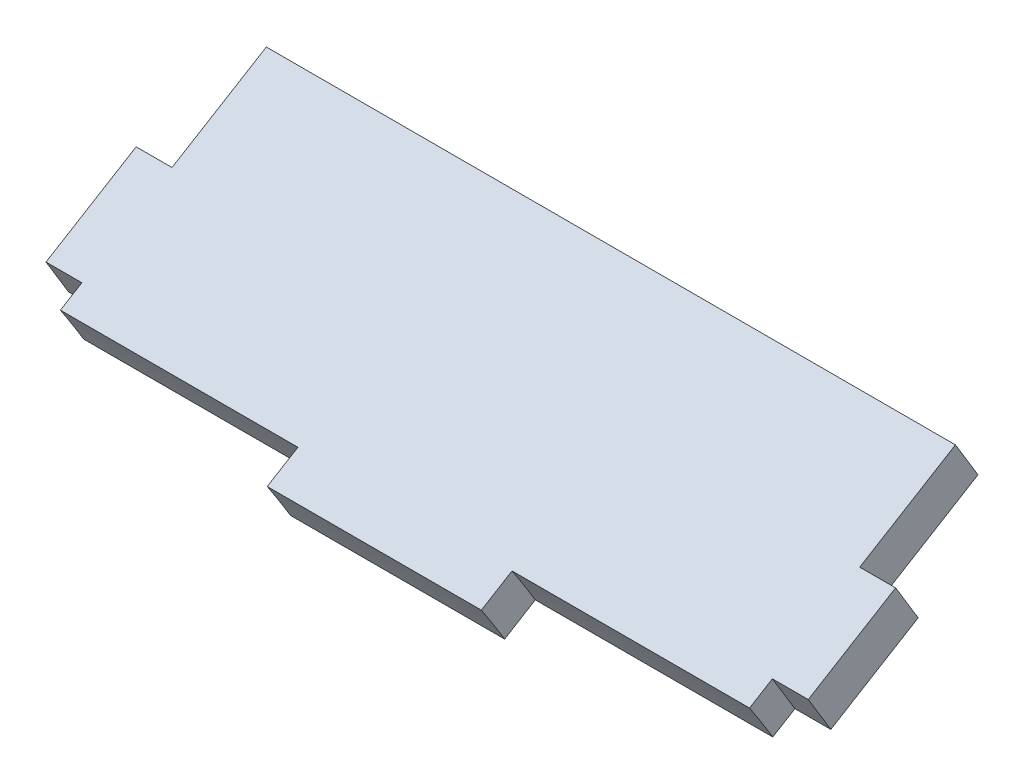
ISO-10303-21;
HEADER;
FILE_DESCRIPTION(('STEP AP214'),'2;1');
FILE_NAME('part.step','',(''),(''),'','','');
FILE_SCHEMA(('AUTOMOTIVE_DESIGN { 1 0 10303 214 1 1 1 1 }'));
ENDSEC;
DATA;
#1=APPLICATION_CONTEXT('core data for automotive mechanical design processes');
#2=APPLICATION_PROTOCOL_DEFINITION('international standard','automotive_design',2000,#1);
#3=PRODUCT_CONTEXT('',#1,'mechanical');
#4=PRODUCT('Part','Part','',(#3));
#5=PRODUCT_RELATED_PRODUCT_CATEGORY('part','',(#4));
#6=PRODUCT_DEFINITION_FORMATION('','',#4);
#7=PRODUCT_DEFINITION_CONTEXT('part definition',#1,'design');
#8=PRODUCT_DEFINITION('design','',#6,#7);
#9=PRODUCT_DEFINITION_SHAPE('','',#8);
#10=(LENGTH_UNIT() NAMED_UNIT(*) SI_UNIT(.MILLI.,.METRE.));
#11=(NAMED_UNIT(*) PLANE_ANGLE_UNIT() SI_UNIT($,.RADIAN.));
#12=(NAMED_UNIT(*) SI_UNIT($,.STERADIAN.) SOLID_ANGLE_UNIT());
#13=UNCERTAINTY_MEASURE_WITH_UNIT(LENGTH_MEASURE(1.E-05),#10,'distance_accuracy_value','');
#14=(GEOMETRIC_REPRESENTATION_CONTEXT(3) GLOBAL_UNCERTAINTY_ASSIGNED_CONTEXT((#13)) GLOBAL_UNIT_ASSIGNED_CONTEXT((#10,
#11,#12)) REPRESENTATION_CONTEXT('',''));
#15=CARTESIAN_POINT('',(0.,0.,0.));
#16=DIRECTION('',(0.,0.,1.));
#17=DIRECTION('',(1.,0.,0.));
#18=AXIS2_PLACEMENT_3D('',#15,#16,#17);
#19=CARTESIAN_POINT('',(-263.,125.092216151068,174.308993959894));
#20=DIRECTION('',(0.,0.518815236901239,-0.854886395937561));
#21=DIRECTION('',(0.,0.854886395937561,0.518815236901239));
#22=AXIS2_PLACEMENT_3D('',#19,#20,#21);
#23=PLANE('',#22);
#24=DIRECTION('',(0.,-0.854886395937561,-0.518815236901239));
#25=VECTOR('',#24,1.);
#26=CARTESIAN_POINT('',(-259.7,125.092216151068,174.308993959894));
#27=LINE('',#26,#25);
#28=CARTESIAN_POINT('',(-259.7,128.768227653599,176.53989947857));
#29=VERTEX_POINT('',#28);
#30=CARTESIAN_POINT('',(-259.7,125.348682069849,174.464638530965));
#31=VERTEX_POINT('',#30);
#32=EDGE_CURVE('E264',#29,#31,#27,.T.);
#33=ORIENTED_EDGE('',*,*,#32,.F.);
#34=DIRECTION('',(1.,0.,0.));
#35=VECTOR('',#34,1.);
#36=CARTESIAN_POINT('',(-359.949570915867,128.768227653599,176.53989947857));
#37=LINE('',#36,#35);
#38=CARTESIAN_POINT('',(-263.,128.768227653599,176.53989947857));
#39=VERTEX_POINT('',#38);
#40=EDGE_CURVE('E227',#39,#29,#37,.T.);
#41=ORIENTED_EDGE('',*,*,#40,.F.);
#42=DIRECTION('',(0.,0.854886395937561,0.518815236901239));
#43=VECTOR('',#42,1.);
#44=CARTESIAN_POINT('',(-263.,125.092216151068,174.308993959894));
#45=LINE('',#44,#43);
#46=CARTESIAN_POINT('',(-263.,125.348682069849,174.464638530965));
#47=VERTEX_POINT('',#46);
#48=EDGE_CURVE('E190',#47,#39,#45,.T.);
#49=ORIENTED_EDGE('',*,*,#48,.F.);
#50=DIRECTION('',(1.,0.,0.));
#51=VECTOR('',#50,1.);
#52=CARTESIAN_POINT('',(-359.949570915867,125.348682069849,174.464638530965));
#53=LINE('',#52,#51);
#54=EDGE_CURVE('E229',#47,#31,#53,.T.);
#55=ORIENTED_EDGE('',*,*,#54,.T.);
#56=EDGE_LOOP('',(#33,#41,#49,#55));
#57=FACE_BOUND('',#56,.T.);
#58=ADVANCED_FACE('F42',(#57),#23,.F.);
#59=CARTESIAN_POINT('',(-263.,133.901556799252,168.659611927827));
#60=DIRECTION('',(0.,-0.518815236901239,0.854886395937561));
#61=DIRECTION('',(0.,-0.854886395937561,-0.518815236901239));
#62=AXIS2_PLACEMENT_3D('',#59,#60,#61);
#63=PLANE('',#62);
#64=DIRECTION('',(0.,0.854886395937561,0.518815236901239));
#65=VECTOR('',#64,1.);
#66=CARTESIAN_POINT('',(-259.7,133.901556799252,168.659611927827));
#67=LINE('',#66,#65);
#68=CARTESIAN_POINT('',(-259.7,130.22554529672,166.428706409151));
#69=VERTEX_POINT('',#68);
#70=CARTESIAN_POINT('',(-259.7,133.645090880471,168.503967356756));
#71=VERTEX_POINT('',#70);
#72=EDGE_CURVE('E261',#69,#71,#67,.T.);
#73=ORIENTED_EDGE('',*,*,#72,.F.);
#74=DIRECTION('',(-1.,0.,0.));
#75=VECTOR('',#74,1.);
#76=CARTESIAN_POINT('',(-359.949570915867,130.22554529672,166.428706409151));
#77=LINE('',#76,#75);
#78=CARTESIAN_POINT('',(-263.,130.22554529672,166.428706409151));
#79=VERTEX_POINT('',#78);
#80=EDGE_CURVE('E221',#69,#79,#77,.T.);
#81=ORIENTED_EDGE('',*,*,#80,.T.);
#82=DIRECTION('',(0.,-0.854886395937561,-0.518815236901239));
#83=VECTOR('',#82,1.);
#84=CARTESIAN_POINT('',(-263.,133.901556799252,168.659611927827));
#85=LINE('',#84,#83);
#86=CARTESIAN_POINT('',(-263.,133.645090880471,168.503967356756));
#87=VERTEX_POINT('',#86);
#88=EDGE_CURVE('E230',#87,#79,#85,.T.);
#89=ORIENTED_EDGE('',*,*,#88,.F.);
#90=DIRECTION('',(-1.,0.,0.));
#91=VECTOR('',#90,1.);
#92=CARTESIAN_POINT('',(-359.949570915867,133.645090880471,168.503967356756));
#93=LINE('',#92,#91);
#94=EDGE_CURVE('E206',#71,#87,#93,.T.);
#95=ORIENTED_EDGE('',*,*,#94,.F.);
#96=EDGE_LOOP('',(#73,#81,#89,#95));
#97=FACE_BOUND('',#96,.T.);
#98=ADVANCED_FACE('F260',(#97),#63,.F.);
#99=CARTESIAN_POINT('',(-359.949570915867,127.376330221479,178.83342151614));
#100=DIRECTION('',(0.,-0.854886395937591,-0.518815236901189));
#101=DIRECTION('',(0.,0.518815236901189,-0.854886395937591));
#102=AXIS2_PLACEMENT_3D('',#99,#100,#101);
#103=PLANE('',#102);
#104=DIRECTION('',(-1.,0.,0.));
#105=VECTOR('',#104,1.);
#106=CARTESIAN_POINT('',(-359.949570915867,128.690405368064,176.66813243796));
#107=LINE('',#106,#105);
#108=CARTESIAN_POINT('',(-326.4,128.690405368064,176.66813243796));
#109=VERTEX_POINT('',#108);
#110=CARTESIAN_POINT('',(-329.7,128.690405368064,176.66813243796));
#111=VERTEX_POINT('',#110);
#112=EDGE_CURVE('E65',#109,#111,#107,.T.);
#113=ORIENTED_EDGE('',*,*,#112,.F.);
#114=DIRECTION('',(0.,-0.518815236901189,0.854886395937591));
#115=VECTOR('',#114,1.);
#116=CARTESIAN_POINT('',(-326.4,127.376330221479,178.83342151614));
#117=LINE('',#116,#115);
#118=CARTESIAN_POINT('',(-326.4,127.492166075794,178.642551069452));
#119=VERTEX_POINT('',#118);
#120=EDGE_CURVE('E200',#109,#119,#117,.T.);
#121=ORIENTED_EDGE('',*,*,#120,.T.);
#122=DIRECTION('',(1.,0.,0.));
#123=VECTOR('',#122,1.);
#124=CARTESIAN_POINT('',(-330.7,127.492166075794,178.642551069452));
#125=LINE('',#124,#123);
#126=CARTESIAN_POINT('',(-304.55,127.492166075794,178.642551069452));
#127=VERTEX_POINT('',#126);
#128=EDGE_CURVE('E222',#127,#119,#125,.F.);
#129=ORIENTED_EDGE('',*,*,#128,.F.);
#130=DIRECTION('',(0.,-0.518815236901234,0.854886395937563));
#131=VECTOR('',#130,1.);
#132=CARTESIAN_POINT('',(-304.55,127.33640658698,178.899206345849));
#133=LINE('',#132,#131);
#134=CARTESIAN_POINT('',(-304.55,125.778774108113,181.46582105055));
#135=VERTEX_POINT('',#134);
#136=EDGE_CURVE('E287',#127,#135,#133,.T.);
#137=ORIENTED_EDGE('',*,*,#136,.T.);
#138=DIRECTION('',(1.,0.,0.));
#139=VECTOR('',#138,1.);
#140=CARTESIAN_POINT('',(-330.701333630157,125.778774108113,181.46582105055));
#141=LINE('',#140,#139);
#142=CARTESIAN_POINT('',(-284.85,125.778774108113,181.46582105055));
#143=VERTEX_POINT('',#142);
#144=EDGE_CURVE('E267',#143,#135,#141,.F.);
#145=ORIENTED_EDGE('',*,*,#144,.F.);
#146=DIRECTION('',(0.,0.51881523690124,-0.85488639593756));
#147=VECTOR('',#146,1.);
#148=CARTESIAN_POINT('',(-284.850000000006,127.33640658698,178.899206345849));
#149=LINE('',#148,#147);
#150=CARTESIAN_POINT('',(-284.850000000006,127.492166075794,178.642551069452));
#151=VERTEX_POINT('',#150);
#152=EDGE_CURVE('E283',#143,#151,#149,.T.);
#153=ORIENTED_EDGE('',*,*,#152,.T.);
#154=CARTESIAN_POINT('',(-263.,127.492166075794,178.642551069452));
#155=VERTEX_POINT('',#154);
#156=EDGE_CURVE('E219',#155,#151,#125,.F.);
#157=ORIENTED_EDGE('',*,*,#156,.F.);
#158=DIRECTION('',(0.,0.518815236901189,-0.854886395937591));
#159=VECTOR('',#158,1.);
#160=CARTESIAN_POINT('',(-263.,127.376330221479,178.83342151614));
#161=LINE('',#160,#159);
#162=EDGE_CURVE('E225',#155,#39,#161,.T.);
#163=ORIENTED_EDGE('',*,*,#162,.T.);
#164=ORIENTED_EDGE('',*,*,#40,.T.);
#165=DIRECTION('',(0.,0.518815236901189,-0.854886395937591));
#166=VECTOR('',#165,1.);
#167=CARTESIAN_POINT('',(-259.7,140.841436247018,156.646070138711));
#168=LINE('',#167,#166);
#169=EDGE_CURVE('E177',#29,#71,#168,.T.);
#170=ORIENTED_EDGE('',*,*,#169,.T.);
#171=ORIENTED_EDGE('',*,*,#94,.T.);
#172=DIRECTION('',(0.,0.518815236901189,-0.854886395937591));
#173=VECTOR('',#172,1.);
#174=CARTESIAN_POINT('',(-263.,127.376330221479,178.83342151614));
#175=LINE('',#174,#173);
#176=CARTESIAN_POINT('',(-263.,138.988716152912,159.698920346798));
#177=VERTEX_POINT('',#176);
#178=EDGE_CURVE('E218',#87,#177,#175,.T.);
#179=ORIENTED_EDGE('',*,*,#178,.T.);
#180=DIRECTION('',(1.,0.,0.));
#181=VECTOR('',#180,1.);
#182=CARTESIAN_POINT('',(-359.949570915867,138.988716152912,159.698920346798));
#183=LINE('',#182,#181);
#184=CARTESIAN_POINT('',(-326.4,138.988716152911,159.698920346798));
#185=VERTEX_POINT('',#184);
#186=EDGE_CURVE('E210',#185,#177,#183,.T.);
#187=ORIENTED_EDGE('',*,*,#186,.F.);
#188=DIRECTION('',(0.,-0.518815236901189,0.854886395937591));
#189=VECTOR('',#188,1.);
#190=CARTESIAN_POINT('',(-326.4,127.376330221479,178.83342151614));
#191=LINE('',#190,#189);
#192=CARTESIAN_POINT('',(-326.4,133.722913166006,168.375734397366));
#193=VERTEX_POINT('',#192);
#194=EDGE_CURVE('E198',#185,#193,#191,.T.);
#195=ORIENTED_EDGE('',*,*,#194,.T.);
#196=DIRECTION('',(1.,0.,0.));
#197=VECTOR('',#196,1.);
#198=CARTESIAN_POINT('',(-359.949570915867,133.722913166006,168.375734397366));
#199=LINE('',#198,#197);
#200=CARTESIAN_POINT('',(-329.7,133.722913166006,168.375734397366));
#201=VERTEX_POINT('',#200);
#202=EDGE_CURVE('E168',#201,#193,#199,.T.);
#203=ORIENTED_EDGE('',*,*,#202,.F.);
#204=DIRECTION('',(0.,-0.518815236901189,0.854886395937591));
#205=VECTOR('',#204,1.);
#206=CARTESIAN_POINT('',(-329.7,140.841436247018,156.646070138711));
#207=LINE('',#206,#205);
#208=EDGE_CURVE('E323',#201,#111,#207,.T.);
#209=ORIENTED_EDGE('',*,*,#208,.T.);
#210=EDGE_LOOP('',(#113,#121,#129,#137,#145,#153,#157,#163,#164,#170,#171,#179,#187,#195,#203,#209));
#211=FACE_BOUND('',#210,.T.);
#212=ADVANCED_FACE('F310',(#211),#103,.F.);
#213=CARTESIAN_POINT('',(-359.949570915867,123.956784637729,176.758160568536));
#214=DIRECTION('',(0.,-0.854886395937591,-0.518815236901189));
#215=DIRECTION('',(0.,0.518815236901189,-0.854886395937591));
#216=AXIS2_PLACEMENT_3D('',#213,#214,#215);
#217=PLANE('',#216);
#218=DIRECTION('',(0.,-0.518815236901189,0.854886395937591));
#219=VECTOR('',#218,1.);
#220=CARTESIAN_POINT('',(-326.4,123.956784637729,176.758160568536));
#221=LINE('',#220,#219);
#222=CARTESIAN_POINT('',(-326.4,125.270859784314,174.592871490355));
#223=VERTEX_POINT('',#222);
#224=CARTESIAN_POINT('',(-326.4,124.112429208799,176.501694649754));
#225=VERTEX_POINT('',#224);
#226=EDGE_CURVE('E185',#223,#225,#221,.T.);
#227=ORIENTED_EDGE('',*,*,#226,.F.);
#228=DIRECTION('',(-1.,0.,0.));
#229=VECTOR('',#228,1.);
#230=CARTESIAN_POINT('',(-359.949570915867,125.270859784314,174.592871490355));
#231=LINE('',#230,#229);
#232=CARTESIAN_POINT('',(-329.7,125.270859784314,174.592871490355));
#233=VERTEX_POINT('',#232);
#234=EDGE_CURVE('E57',#223,#233,#231,.T.);
#235=ORIENTED_EDGE('',*,*,#234,.T.);
#236=DIRECTION('',(0.,0.518815236901189,-0.854886395937591));
#237=VECTOR('',#236,1.);
#238=CARTESIAN_POINT('',(-329.7,123.956784637729,176.758160568536));
#239=LINE('',#238,#237);
#240=CARTESIAN_POINT('',(-329.7,130.303367582256,166.300473449761));
#241=VERTEX_POINT('',#240);
#242=EDGE_CURVE('E165',#233,#241,#239,.T.);
#243=ORIENTED_EDGE('',*,*,#242,.T.);
#244=DIRECTION('',(1.,0.,0.));
#245=VECTOR('',#244,1.);
#246=CARTESIAN_POINT('',(-359.949570915867,130.303367582256,166.300473449761));
#247=LINE('',#246,#245);
#248=CARTESIAN_POINT('',(-326.4,130.303367582256,166.300473449761));
#249=VERTEX_POINT('',#248);
#250=EDGE_CURVE('E158',#241,#249,#247,.T.);
#251=ORIENTED_EDGE('',*,*,#250,.T.);
#252=DIRECTION('',(0.,-0.518815236901189,0.854886395937591));
#253=VECTOR('',#252,1.);
#254=CARTESIAN_POINT('',(-326.4,123.956784637729,176.758160568536));
#255=LINE('',#254,#253);
#256=CARTESIAN_POINT('',(-326.4,135.569170569161,157.623659399193));
#257=VERTEX_POINT('',#256);
#258=EDGE_CURVE('E163',#257,#249,#255,.T.);
#259=ORIENTED_EDGE('',*,*,#258,.F.);
#260=DIRECTION('',(1.,0.,0.));
#261=VECTOR('',#260,1.);
#262=CARTESIAN_POINT('',(-359.949570915867,135.569170569162,157.623659399193));
#263=LINE('',#262,#261);
#264=CARTESIAN_POINT('',(-263.,135.569170569162,157.623659399194));
#265=VERTEX_POINT('',#264);
#266=EDGE_CURVE('E215',#257,#265,#263,.T.);
#267=ORIENTED_EDGE('',*,*,#266,.T.);
#268=DIRECTION('',(0.,-0.518815236901189,0.854886395937591));
#269=VECTOR('',#268,1.);
#270=CARTESIAN_POINT('',(-263.,123.956784637729,176.758160568536));
#271=LINE('',#270,#269);
#272=EDGE_CURVE('E217',#265,#79,#271,.T.);
#273=ORIENTED_EDGE('',*,*,#272,.T.);
#274=ORIENTED_EDGE('',*,*,#80,.F.);
#275=DIRECTION('',(0.,-0.518815236901189,0.854886395937591));
#276=VECTOR('',#275,1.);
#277=CARTESIAN_POINT('',(-259.7,123.956784637729,176.758160568536));
#278=LINE('',#277,#276);
#279=EDGE_CURVE('E12',#69,#31,#278,.T.);
#280=ORIENTED_EDGE('',*,*,#279,.T.);
#281=ORIENTED_EDGE('',*,*,#54,.F.);
#282=CARTESIAN_POINT('',(-263.,124.112429208799,176.501694649754));
#283=VERTEX_POINT('',#282);
#284=EDGE_CURVE('E245',#47,#283,#271,.T.);
#285=ORIENTED_EDGE('',*,*,#284,.T.);
#286=DIRECTION('',(1.,0.,0.));
#287=VECTOR('',#286,1.);
#288=CARTESIAN_POINT('',(-330.7,124.112429208799,176.501694649754));
#289=LINE('',#288,#287);
#290=CARTESIAN_POINT('',(-284.850000000006,124.112429208799,176.501694649754));
#291=VERTEX_POINT('',#290);
#292=EDGE_CURVE('E207',#283,#291,#289,.F.);
#293=ORIENTED_EDGE('',*,*,#292,.T.);
#294=DIRECTION('',(0.,0.51881523690124,-0.85488639593756));
#295=VECTOR('',#294,1.);
#296=CARTESIAN_POINT('',(-284.850000000006,123.916861003229,176.823945398244));
#297=LINE('',#296,#295);
#298=CARTESIAN_POINT('',(-284.85,122.400338927025,179.322819756348));
#299=VERTEX_POINT('',#298);
#300=EDGE_CURVE('E284',#299,#291,#297,.T.);
#301=ORIENTED_EDGE('',*,*,#300,.F.);
#302=DIRECTION('',(1.,0.,0.));
#303=VECTOR('',#302,1.);
#304=CARTESIAN_POINT('',(-330.701333630157,122.400338927025,179.322819756348));
#305=LINE('',#304,#303);
#306=CARTESIAN_POINT('',(-304.55,122.400338927025,179.322819756348));
#307=VERTEX_POINT('',#306);
#308=EDGE_CURVE('E277',#307,#299,#305,.T.);
#309=ORIENTED_EDGE('',*,*,#308,.F.);
#310=DIRECTION('',(0.,-0.518815236901234,0.854886395937563));
#311=VECTOR('',#310,1.);
#312=CARTESIAN_POINT('',(-304.55,123.916861003229,176.823945398244));
#313=LINE('',#312,#311);
#314=CARTESIAN_POINT('',(-304.55,124.112429208799,176.501694649754));
#315=VERTEX_POINT('',#314);
#316=EDGE_CURVE('E286',#315,#307,#313,.T.);
#317=ORIENTED_EDGE('',*,*,#316,.F.);
#318=EDGE_CURVE('E211',#315,#225,#289,.F.);
#319=ORIENTED_EDGE('',*,*,#318,.T.);
#320=EDGE_LOOP('',(#227,#235,#243,#251,#259,#267,#273,#274,#280,#281,#285,#293,#301,#309,#317,#319));
#321=FACE_BOUND('',#320,.T.);
#322=ADVANCED_FACE('F161',(#321),#217,.T.);
#323=CARTESIAN_POINT('',(-326.4,133.979379084788,168.531378968436));
#324=DIRECTION('',(0.,0.518815236901239,-0.854886395937561));
#325=DIRECTION('',(0.,0.854886395937561,0.518815236901239));
#326=AXIS2_PLACEMENT_3D('',#323,#324,#325);
#327=PLANE('',#326);
#328=ORIENTED_EDGE('',*,*,#250,.F.);
#329=DIRECTION('',(0.,0.854886395937561,0.518815236901239));
#330=VECTOR('',#329,1.);
#331=CARTESIAN_POINT('',(-329.7,133.979379084788,168.531378968436));
#332=LINE('',#331,#330);
#333=EDGE_CURVE('E265',#241,#201,#332,.T.);
#334=ORIENTED_EDGE('',*,*,#333,.T.);
#335=ORIENTED_EDGE('',*,*,#202,.T.);
#336=DIRECTION('',(0.,0.854886395937561,0.518815236901237));
#337=VECTOR('',#336,1.);
#338=CARTESIAN_POINT('',(-326.4,-38.6852712980695,63.7442962419567));
#339=LINE('',#338,#337);
#340=EDGE_CURVE('E172',#249,#193,#339,.T.);
#341=ORIENTED_EDGE('',*,*,#340,.F.);
#342=EDGE_LOOP('',(#328,#334,#335,#341));
#343=FACE_BOUND('',#342,.T.);
#344=ADVANCED_FACE('F173',(#343),#327,.T.);
#345=CARTESIAN_POINT('',(-326.4,125.014393865533,174.437226919285));
#346=DIRECTION('',(0.,-0.518815236901239,0.854886395937561));
#347=DIRECTION('',(0.,-0.854886395937561,-0.518815236901239));
#348=AXIS2_PLACEMENT_3D('',#345,#346,#347);
#349=PLANE('',#348);
#350=ORIENTED_EDGE('',*,*,#112,.T.);
#351=DIRECTION('',(0.,-0.854886395937561,-0.518815236901239));
#352=VECTOR('',#351,1.);
#353=CARTESIAN_POINT('',(-329.7,125.014393865533,174.437226919285));
#354=LINE('',#353,#352);
#355=EDGE_CURVE('E50',#111,#233,#354,.T.);
#356=ORIENTED_EDGE('',*,*,#355,.T.);
#357=ORIENTED_EDGE('',*,*,#234,.F.);
#358=DIRECTION('',(0.,-0.854886395937561,-0.518815236901237));
#359=VECTOR('',#358,1.);
#360=CARTESIAN_POINT('',(-326.4,-43.7177790960115,72.0366942825511));
#361=LINE('',#360,#359);
#362=EDGE_CURVE('E178',#109,#223,#361,.T.);
#363=ORIENTED_EDGE('',*,*,#362,.F.);
#364=EDGE_LOOP('',(#350,#356,#357,#363));
#365=FACE_BOUND('',#364,.T.);
#366=ADVANCED_FACE('F195',(#365),#349,.T.);
#367=CARTESIAN_POINT('',(-330.7,70.,265.666345746042));
#368=DIRECTION('',(1.,0.,0.));
#369=DIRECTION('',(0.,0.,-1.));
#370=AXIS2_PLACEMENT_3D('',#367,#368,#369);
#371=CYLINDRICAL_SURFACE('',#370,104.3);
#372=CARTESIAN_POINT('',(-284.850000000006,70.,265.666345746042));
#373=DIRECTION('',(1.,0.,0.));
#374=DIRECTION('',(0.,0.,-1.));
#375=AXIS2_PLACEMENT_3D('',#372,#373,#374);
#376=CIRCLE('',#375,104.3);
#377=EDGE_CURVE('E188',#291,#151,#376,.T.);
#378=ORIENTED_EDGE('',*,*,#377,.F.);
#379=ORIENTED_EDGE('',*,*,#292,.F.);
#380=CARTESIAN_POINT('',(-263.,70.,265.666345746042));
#381=DIRECTION('',(1.,0.,0.));
#382=DIRECTION('',(0.,0.,-1.));
#383=AXIS2_PLACEMENT_3D('',#380,#381,#382);
#384=CIRCLE('',#383,104.3);
#385=EDGE_CURVE('E243',#283,#155,#384,.T.);
#386=ORIENTED_EDGE('',*,*,#385,.T.);
#387=ORIENTED_EDGE('',*,*,#156,.T.);
#388=EDGE_LOOP('',(#378,#379,#386,#387));
#389=FACE_BOUND('',#388,.T.);
#390=ADVANCED_FACE('F316',(#389),#371,.F.);
#391=CARTESIAN_POINT('',(-263.,0.,0.));
#392=DIRECTION('',(-1.,0.,0.));
#393=DIRECTION('',(0.,0.,1.));
#394=AXIS2_PLACEMENT_3D('',#391,#392,#393);
#395=PLANE('',#394);
#396=ORIENTED_EDGE('',*,*,#88,.T.);
#397=ORIENTED_EDGE('',*,*,#272,.F.);
#398=DIRECTION('',(0.,-0.854886395937563,-0.518815236901235));
#399=VECTOR('',#398,1.);
#400=CARTESIAN_POINT('',(-263.,135.569170569162,157.623659399193));
#401=LINE('',#400,#399);
#402=EDGE_CURVE('E214',#177,#265,#401,.T.);
#403=ORIENTED_EDGE('',*,*,#402,.F.);
#404=ORIENTED_EDGE('',*,*,#178,.F.);
#405=EDGE_LOOP('',(#396,#397,#403,#404));
#406=FACE_BOUND('',#405,.T.);
#407=ADVANCED_FACE('F256',(#406),#395,.F.);
#408=CARTESIAN_POINT('',(-263.,0.,0.));
#409=DIRECTION('',(-1.,0.,0.));
#410=DIRECTION('',(0.,0.,1.));
#411=AXIS2_PLACEMENT_3D('',#408,#409,#410);
#412=PLANE('',#411);
#413=ORIENTED_EDGE('',*,*,#162,.F.);
#414=ORIENTED_EDGE('',*,*,#385,.F.);
#415=ORIENTED_EDGE('',*,*,#284,.F.);
#416=ORIENTED_EDGE('',*,*,#48,.T.);
#417=EDGE_LOOP('',(#413,#414,#415,#416));
#418=FACE_BOUND('',#417,.T.);
#419=ADVANCED_FACE('F318',(#418),#412,.F.);
#420=CARTESIAN_POINT('',(-359.949570915867,135.569170569162,157.623659399193));
#421=DIRECTION('',(0.,0.518815236901235,-0.854886395937563));
#422=DIRECTION('',(0.,0.854886395937563,0.518815236901235));
#423=AXIS2_PLACEMENT_3D('',#420,#421,#422);
#424=PLANE('',#423);
#425=ORIENTED_EDGE('',*,*,#266,.F.);
#426=DIRECTION('',(0.,0.854886395937563,0.518815236901235));
#427=VECTOR('',#426,1.);
#428=CARTESIAN_POINT('',(-326.4,135.569170569162,157.623659399193));
#429=LINE('',#428,#427);
#430=EDGE_CURVE('E182',#257,#185,#429,.T.);
#431=ORIENTED_EDGE('',*,*,#430,.T.);
#432=ORIENTED_EDGE('',*,*,#186,.T.);
#433=ORIENTED_EDGE('',*,*,#402,.T.);
#434=EDGE_LOOP('',(#425,#431,#432,#433));
#435=FACE_BOUND('',#434,.T.);
#436=ADVANCED_FACE('F344',(#435),#424,.T.);
#437=CARTESIAN_POINT('',(-326.4,0.,0.));
#438=DIRECTION('',(1.,0.,0.));
#439=DIRECTION('',(0.,0.,-1.));
#440=AXIS2_PLACEMENT_3D('',#437,#438,#439);
#441=PLANE('',#440);
#442=ORIENTED_EDGE('',*,*,#258,.T.);
#443=ORIENTED_EDGE('',*,*,#340,.T.);
#444=ORIENTED_EDGE('',*,*,#194,.F.);
#445=ORIENTED_EDGE('',*,*,#430,.F.);
#446=EDGE_LOOP('',(#442,#443,#444,#445));
#447=FACE_BOUND('',#446,.T.);
#448=ADVANCED_FACE('F180',(#447),#441,.F.);
#449=CARTESIAN_POINT('',(-326.4,0.,0.));
#450=DIRECTION('',(1.,0.,0.));
#451=DIRECTION('',(0.,0.,-1.));
#452=AXIS2_PLACEMENT_3D('',#449,#450,#451);
#453=PLANE('',#452);
#454=ORIENTED_EDGE('',*,*,#120,.F.);
#455=ORIENTED_EDGE('',*,*,#362,.T.);
#456=ORIENTED_EDGE('',*,*,#226,.T.);
#457=CARTESIAN_POINT('',(-326.4,70.,265.666345746042));
#458=DIRECTION('',(-1.,0.,0.));
#459=DIRECTION('',(0.,0.,1.));
#460=AXIS2_PLACEMENT_3D('',#457,#458,#459);
#461=CIRCLE('',#460,104.3);
#462=EDGE_CURVE('E169',#119,#225,#461,.T.);
#463=ORIENTED_EDGE('',*,*,#462,.F.);
#464=EDGE_LOOP('',(#454,#455,#456,#463));
#465=FACE_BOUND('',#464,.T.);
#466=ADVANCED_FACE('F299',(#465),#453,.F.);
#467=CARTESIAN_POINT('',(-304.55,70.,265.666345746042));
#468=DIRECTION('',(-1.,0.,0.));
#469=DIRECTION('',(0.,0.,1.));
#470=AXIS2_PLACEMENT_3D('',#467,#468,#469);
#471=CIRCLE('',#470,104.3);
#472=EDGE_CURVE('E184',#127,#315,#471,.T.);
#473=ORIENTED_EDGE('',*,*,#472,.F.);
#474=ORIENTED_EDGE('',*,*,#128,.T.);
#475=ORIENTED_EDGE('',*,*,#462,.T.);
#476=ORIENTED_EDGE('',*,*,#318,.F.);
#477=EDGE_LOOP('',(#473,#474,#475,#476));
#478=FACE_BOUND('',#477,.T.);
#479=ADVANCED_FACE('F44',(#478),#371,.F.);
#480=CARTESIAN_POINT('',(-284.850000000006,123.916861003229,176.823945398244));
#481=DIRECTION('',(1.,0.,0.));
#482=DIRECTION('',(0.,0.,-1.));
#483=AXIS2_PLACEMENT_3D('',#480,#481,#482);
#484=PLANE('',#483);
#485=ORIENTED_EDGE('',*,*,#152,.F.);
#486=CARTESIAN_POINT('',(-284.85,70.,265.666345746042));
#487=DIRECTION('',(1.,0.,0.));
#488=DIRECTION('',(0.,0.,-1.));
#489=AXIS2_PLACEMENT_3D('',#486,#487,#488);
#490=CIRCLE('',#489,101.);
#491=EDGE_CURVE('E274',#299,#143,#490,.T.);
#492=ORIENTED_EDGE('',*,*,#491,.F.);
#493=ORIENTED_EDGE('',*,*,#300,.T.);
#494=ORIENTED_EDGE('',*,*,#377,.T.);
#495=EDGE_LOOP('',(#485,#492,#493,#494));
#496=FACE_BOUND('',#495,.T.);
#497=ADVANCED_FACE('F313',(#496),#484,.T.);
#498=CARTESIAN_POINT('',(-304.55,123.916861003229,176.823945398244));
#499=DIRECTION('',(-1.,0.,0.));
#500=DIRECTION('',(0.,0.,1.));
#501=AXIS2_PLACEMENT_3D('',#498,#499,#500);
#502=PLANE('',#501);
#503=ORIENTED_EDGE('',*,*,#316,.T.);
#504=CARTESIAN_POINT('',(-304.55,70.,265.666345746042));
#505=DIRECTION('',(-1.,0.,0.));
#506=DIRECTION('',(0.,0.,1.));
#507=AXIS2_PLACEMENT_3D('',#504,#505,#506);
#508=CIRCLE('',#507,101.);
#509=EDGE_CURVE('E280',#135,#307,#508,.T.);
#510=ORIENTED_EDGE('',*,*,#509,.F.);
#511=ORIENTED_EDGE('',*,*,#136,.F.);
#512=ORIENTED_EDGE('',*,*,#472,.T.);
#513=EDGE_LOOP('',(#503,#510,#511,#512));
#514=FACE_BOUND('',#513,.T.);
#515=ADVANCED_FACE('F304',(#514),#502,.T.);
#516=CARTESIAN_POINT('',(-330.701333630157,70.,265.666345746042));
#517=DIRECTION('',(1.,0.,0.));
#518=DIRECTION('',(0.,0.,-1.));
#519=AXIS2_PLACEMENT_3D('',#516,#517,#518);
#520=CYLINDRICAL_SURFACE('',#519,101.);
#521=ORIENTED_EDGE('',*,*,#308,.T.);
#522=ORIENTED_EDGE('',*,*,#491,.T.);
#523=ORIENTED_EDGE('',*,*,#144,.T.);
#524=ORIENTED_EDGE('',*,*,#509,.T.);
#525=EDGE_LOOP('',(#521,#522,#523,#524));
#526=FACE_BOUND('',#525,.T.);
#527=ADVANCED_FACE('F307',(#526),#520,.F.);
#528=CARTESIAN_POINT('',(-329.7,132.292572287642,151.457917769699));
#529=DIRECTION('',(-1.,0.,0.));
#530=DIRECTION('',(0.,0.,1.));
#531=AXIS2_PLACEMENT_3D('',#528,#529,#530);
#532=PLANE('',#531);
#533=ORIENTED_EDGE('',*,*,#242,.F.);
#534=ORIENTED_EDGE('',*,*,#355,.F.);
#535=ORIENTED_EDGE('',*,*,#208,.F.);
#536=ORIENTED_EDGE('',*,*,#333,.F.);
#537=EDGE_LOOP('',(#533,#534,#535,#536));
#538=FACE_BOUND('',#537,.T.);
#539=ADVANCED_FACE('F327',(#538),#532,.T.);
#540=CARTESIAN_POINT('',(-259.7,132.292572287642,151.457917769699));
#541=DIRECTION('',(1.,0.,0.));
#542=DIRECTION('',(0.,0.,-1.));
#543=AXIS2_PLACEMENT_3D('',#540,#541,#542);
#544=PLANE('',#543);
#545=ORIENTED_EDGE('',*,*,#32,.T.);
#546=ORIENTED_EDGE('',*,*,#279,.F.);
#547=ORIENTED_EDGE('',*,*,#72,.T.);
#548=ORIENTED_EDGE('',*,*,#169,.F.);
#549=EDGE_LOOP('',(#545,#546,#547,#548));
#550=FACE_BOUND('',#549,.T.);
#551=ADVANCED_FACE('F322',(#550),#544,.T.);
#552=CLOSED_SHELL('',(#58,#98,#212,#322,#344,#366,#390,#407,#419,#436,#448,#466,#479,#497,#515,
#527,#539,#551));
#553=MANIFOLD_SOLID_BREP('B2',#552);
#554=ADVANCED_BREP_SHAPE_REPRESENTATION('',(#18,#553),#14);
#555=SHAPE_DEFINITION_REPRESENTATION(#9,#554);
ENDSEC;
END-ISO-10303-21;
